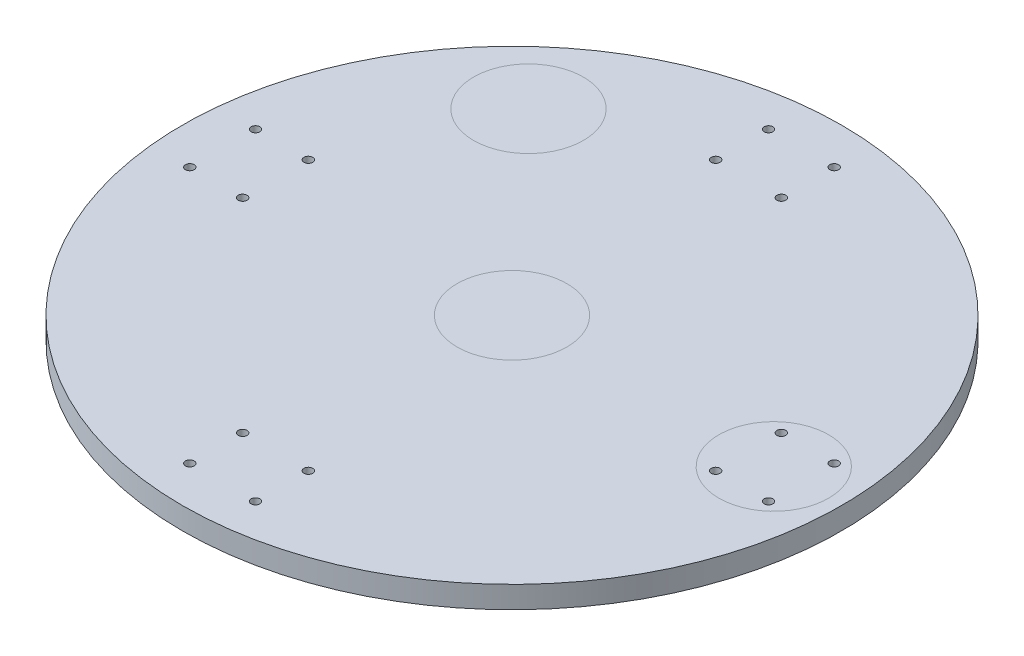
ISO-10303-21;
HEADER;
FILE_DESCRIPTION(('STEP AP214'),'2;1');
FILE_NAME('part.step','',(''),(''),'','','');
FILE_SCHEMA(('AUTOMOTIVE_DESIGN { 1 0 10303 214 1 1 1 1 }'));
ENDSEC;
DATA;
#1=APPLICATION_CONTEXT('core data for automotive mechanical design processes');
#2=APPLICATION_PROTOCOL_DEFINITION('international standard','automotive_design',2000,#1);
#3=PRODUCT_CONTEXT('',#1,'mechanical');
#4=PRODUCT('Part','Part','',(#3));
#5=PRODUCT_RELATED_PRODUCT_CATEGORY('part','',(#4));
#6=PRODUCT_DEFINITION_FORMATION('','',#4);
#7=PRODUCT_DEFINITION_CONTEXT('part definition',#1,'design');
#8=PRODUCT_DEFINITION('design','',#6,#7);
#9=PRODUCT_DEFINITION_SHAPE('','',#8);
#10=(LENGTH_UNIT() NAMED_UNIT(*) SI_UNIT(.MILLI.,.METRE.));
#11=(NAMED_UNIT(*) PLANE_ANGLE_UNIT() SI_UNIT($,.RADIAN.));
#12=(NAMED_UNIT(*) SI_UNIT($,.STERADIAN.) SOLID_ANGLE_UNIT());
#13=UNCERTAINTY_MEASURE_WITH_UNIT(LENGTH_MEASURE(1.E-05),#10,'distance_accuracy_value','');
#14=(GEOMETRIC_REPRESENTATION_CONTEXT(3) GLOBAL_UNCERTAINTY_ASSIGNED_CONTEXT((#13)) GLOBAL_UNIT_ASSIGNED_CONTEXT((#10,
#11,#12)) REPRESENTATION_CONTEXT('',''));
#15=CARTESIAN_POINT('',(0.,0.,0.));
#16=DIRECTION('',(0.,0.,1.));
#17=DIRECTION('',(1.,0.,0.));
#18=AXIS2_PLACEMENT_3D('',#15,#16,#17);
#19=CARTESIAN_POINT('',(0.,10.,0.));
#20=DIRECTION('',(0.,1.,0.));
#21=DIRECTION('',(0.,0.,1.));
#22=AXIS2_PLACEMENT_3D('',#19,#20,#21);
#23=PLANE('',#22);
#24=CARTESIAN_POINT('',(-77.6699029126213,10.,-85.1721094439541));
#25=DIRECTION('',(0.,1.,0.));
#26=DIRECTION('',(0.,0.,1.));
#27=AXIS2_PLACEMENT_3D('',#24,#25,#26);
#28=CIRCLE('',#27,25.);
#29=CARTESIAN_POINT('',(-77.6699029126213,10.,-60.1721094439541));
#30=VERTEX_POINT('',#29);
#31=EDGE_CURVE('E52',#30,#30,#28,.F.);
#32=ORIENTED_EDGE('',*,*,#31,.T.);
#33=EDGE_LOOP('',(#32));
#34=FACE_BOUND('',#33,.T.);
#35=CARTESIAN_POINT('',(0.,10.,0.));
#36=DIRECTION('',(0.,1.,0.));
#37=DIRECTION('',(0.,0.,1.));
#38=AXIS2_PLACEMENT_3D('',#35,#36,#37);
#39=CIRCLE('',#38,150.);
#40=CARTESIAN_POINT('',(0.,10.,150.));
#41=VERTEX_POINT('',#40);
#42=EDGE_CURVE('E64',#41,#41,#39,.T.);
#43=ORIENTED_EDGE('',*,*,#42,.T.);
#44=EDGE_LOOP('',(#43));
#45=FACE_BOUND('',#44,.T.);
#46=CARTESIAN_POINT('',(-14.945,10.,-131.706442493381));
#47=DIRECTION('',(0.,1.,0.));
#48=DIRECTION('',(0.,0.,1.));
#49=AXIS2_PLACEMENT_3D('',#46,#47,#48);
#50=CIRCLE('',#49,2.);
#51=CARTESIAN_POINT('',(-14.945,10.,-129.706442493381));
#52=VERTEX_POINT('',#51);
#53=EDGE_CURVE('E75',#52,#52,#50,.T.);
#54=ORIENTED_EDGE('',*,*,#53,.F.);
#55=EDGE_LOOP('',(#54));
#56=FACE_BOUND('',#55,.T.);
#57=CARTESIAN_POINT('',(-131.706442493367,10.,14.9450000000136));
#58=DIRECTION('',(0.,1.,0.));
#59=DIRECTION('',(0.,0.,1.));
#60=AXIS2_PLACEMENT_3D('',#57,#58,#59);
#61=CIRCLE('',#60,2.);
#62=CARTESIAN_POINT('',(-131.706442493367,10.,16.9450000000136));
#63=VERTEX_POINT('',#62);
#64=EDGE_CURVE('E167',#63,#63,#61,.T.);
#65=ORIENTED_EDGE('',*,*,#64,.F.);
#66=EDGE_LOOP('',(#65));
#67=FACE_BOUND('',#66,.T.);
#68=CARTESIAN_POINT('',(-14.9449999999731,10.,131.706442493381));
#69=DIRECTION('',(0.,1.,0.));
#70=DIRECTION('',(0.,0.,-1.));
#71=AXIS2_PLACEMENT_3D('',#68,#69,#70);
#72=CIRCLE('',#71,2.);
#73=CARTESIAN_POINT('',(-14.9449999999731,10.,129.706442493381));
#74=VERTEX_POINT('',#73);
#75=EDGE_CURVE('E152',#74,#74,#72,.T.);
#76=ORIENTED_EDGE('',*,*,#75,.F.);
#77=EDGE_LOOP('',(#76));
#78=FACE_BOUND('',#77,.T.);
#79=CARTESIAN_POINT('',(-14.9449999999731,10.,107.646442493381));
#80=DIRECTION('',(0.,1.,0.));
#81=DIRECTION('',(0.,0.,-1.));
#82=AXIS2_PLACEMENT_3D('',#79,#80,#81);
#83=CIRCLE('',#82,2.);
#84=CARTESIAN_POINT('',(-14.9449999999731,10.,105.646442493381));
#85=VERTEX_POINT('',#84);
#86=EDGE_CURVE('E151',#85,#85,#83,.T.);
#87=ORIENTED_EDGE('',*,*,#86,.F.);
#88=EDGE_LOOP('',(#87));
#89=FACE_BOUND('',#88,.T.);
#90=CARTESIAN_POINT('',(14.9450000000269,10.,107.646442493381));
#91=DIRECTION('',(0.,1.,0.));
#92=DIRECTION('',(0.,0.,1.));
#93=AXIS2_PLACEMENT_3D('',#90,#91,#92);
#94=CIRCLE('',#93,2.);
#95=CARTESIAN_POINT('',(14.9450000000269,10.,109.646442493381));
#96=VERTEX_POINT('',#95);
#97=EDGE_CURVE('E136',#96,#96,#94,.T.);
#98=ORIENTED_EDGE('',*,*,#97,.F.);
#99=EDGE_LOOP('',(#98));
#100=FACE_BOUND('',#99,.T.);
#101=CARTESIAN_POINT('',(-107.646442493367,10.,14.9450000000136));
#102=DIRECTION('',(0.,1.,0.));
#103=DIRECTION('',(0.,0.,1.));
#104=AXIS2_PLACEMENT_3D('',#101,#102,#103);
#105=CIRCLE('',#104,2.);
#106=CARTESIAN_POINT('',(-107.646442493367,10.,16.9450000000136));
#107=VERTEX_POINT('',#106);
#108=EDGE_CURVE('E168',#107,#107,#105,.T.);
#109=ORIENTED_EDGE('',*,*,#108,.F.);
#110=EDGE_LOOP('',(#109));
#111=FACE_BOUND('',#110,.T.);
#112=CARTESIAN_POINT('',(-107.646442493367,10.,-14.9449999999864));
#113=DIRECTION('',(0.,1.,0.));
#114=DIRECTION('',(0.,0.,-1.));
#115=AXIS2_PLACEMENT_3D('',#112,#113,#114);
#116=CIRCLE('',#115,2.);
#117=CARTESIAN_POINT('',(-107.646442493367,10.,-16.9449999999864));
#118=VERTEX_POINT('',#117);
#119=EDGE_CURVE('E191',#118,#118,#116,.T.);
#120=ORIENTED_EDGE('',*,*,#119,.F.);
#121=EDGE_LOOP('',(#120));
#122=FACE_BOUND('',#121,.T.);
#123=CARTESIAN_POINT('',(-131.706442493367,10.,-14.9449999999864));
#124=DIRECTION('',(0.,1.,0.));
#125=DIRECTION('',(0.,0.,-1.));
#126=AXIS2_PLACEMENT_3D('',#123,#124,#125);
#127=CIRCLE('',#126,2.);
#128=CARTESIAN_POINT('',(-131.706442493367,10.,-16.9449999999864));
#129=VERTEX_POINT('',#128);
#130=EDGE_CURVE('E183',#129,#129,#127,.T.);
#131=ORIENTED_EDGE('',*,*,#130,.F.);
#132=EDGE_LOOP('',(#131));
#133=FACE_BOUND('',#132,.T.);
#134=CARTESIAN_POINT('',(14.9449999999991,10.,-131.706442493381));
#135=DIRECTION('',(0.,1.,0.));
#136=DIRECTION('',(0.,0.,-1.));
#137=AXIS2_PLACEMENT_3D('',#134,#135,#136);
#138=CIRCLE('',#137,2.);
#139=CARTESIAN_POINT('',(14.9449999999991,10.,-133.706442493381));
#140=VERTEX_POINT('',#139);
#141=EDGE_CURVE('E88',#140,#140,#138,.T.);
#142=ORIENTED_EDGE('',*,*,#141,.F.);
#143=EDGE_LOOP('',(#142));
#144=FACE_BOUND('',#143,.T.);
#145=CARTESIAN_POINT('',(14.9449999999993,10.,-107.646442493381));
#146=DIRECTION('',(0.,1.,0.));
#147=DIRECTION('',(0.,0.,-1.));
#148=AXIS2_PLACEMENT_3D('',#145,#146,#147);
#149=CIRCLE('',#148,2.);
#150=CARTESIAN_POINT('',(14.9449999999993,10.,-109.646442493381));
#151=VERTEX_POINT('',#150);
#152=EDGE_CURVE('E87',#151,#151,#149,.T.);
#153=ORIENTED_EDGE('',*,*,#152,.F.);
#154=EDGE_LOOP('',(#153));
#155=FACE_BOUND('',#154,.T.);
#156=CARTESIAN_POINT('',(-14.945,10.,-107.646442493381));
#157=DIRECTION('',(0.,1.,0.));
#158=DIRECTION('',(0.,0.,1.));
#159=AXIS2_PLACEMENT_3D('',#156,#157,#158);
#160=CIRCLE('',#159,2.);
#161=CARTESIAN_POINT('',(-14.945,10.,-105.646442493381));
#162=VERTEX_POINT('',#161);
#163=EDGE_CURVE('E79',#162,#162,#160,.T.);
#164=ORIENTED_EDGE('',*,*,#163,.F.);
#165=EDGE_LOOP('',(#164));
#166=FACE_BOUND('',#165,.T.);
#167=CARTESIAN_POINT('',(14.9450000000269,10.,131.706442493381));
#168=DIRECTION('',(0.,1.,0.));
#169=DIRECTION('',(0.,0.,1.));
#170=AXIS2_PLACEMENT_3D('',#167,#168,#169);
#171=CIRCLE('',#170,2.);
#172=CARTESIAN_POINT('',(14.9450000000269,10.,133.706442493381));
#173=VERTEX_POINT('',#172);
#174=EDGE_CURVE('E135',#173,#173,#171,.T.);
#175=ORIENTED_EDGE('',*,*,#174,.F.);
#176=EDGE_LOOP('',(#175));
#177=FACE_BOUND('',#176,.T.);
#178=CARTESIAN_POINT('',(0.,10.,0.));
#179=DIRECTION('',(0.,1.,0.));
#180=DIRECTION('',(0.,0.,1.));
#181=AXIS2_PLACEMENT_3D('',#178,#179,#180);
#182=CIRCLE('',#181,25.);
#183=CARTESIAN_POINT('',(0.,10.,25.));
#184=VERTEX_POINT('',#183);
#185=EDGE_CURVE('E58',#184,#184,#182,.F.);
#186=ORIENTED_EDGE('',*,*,#185,.T.);
#187=EDGE_LOOP('',(#186));
#188=FACE_BOUND('',#187,.T.);
#189=CARTESIAN_POINT('',(119.152691968226,10.,0.));
#190=DIRECTION('',(0.,1.,0.));
#191=DIRECTION('',(0.,0.,1.));
#192=AXIS2_PLACEMENT_3D('',#189,#190,#191);
#193=CIRCLE('',#192,25.);
#194=CARTESIAN_POINT('',(119.152691968226,10.,25.));
#195=VERTEX_POINT('',#194);
#196=EDGE_CURVE('E10',#195,#195,#193,.F.);
#197=ORIENTED_EDGE('',*,*,#196,.T.);
#198=EDGE_LOOP('',(#197));
#199=FACE_BOUND('',#198,.T.);
#200=ADVANCED_FACE('F44',(#34,#45,#56,#67,#78,#89,#100,#111,#122,#133,#144,#155,#166,#177,#188,
#199),#23,.T.);
#201=ORIENTED_EDGE('',*,*,#196,.F.);
#202=EDGE_LOOP('',(#201));
#203=FACE_BOUND('',#202,.T.);
#204=CARTESIAN_POINT('',(107.646442493394,10.,-14.9450000000134));
#205=DIRECTION('',(0.,1.,0.));
#206=DIRECTION('',(0.,0.,1.));
#207=AXIS2_PLACEMENT_3D('',#204,#205,#206);
#208=CIRCLE('',#207,2.);
#209=CARTESIAN_POINT('',(107.646442493394,10.,-12.9450000000134));
#210=VERTEX_POINT('',#209);
#211=EDGE_CURVE('E104',#210,#210,#208,.T.);
#212=ORIENTED_EDGE('',*,*,#211,.F.);
#213=EDGE_LOOP('',(#212));
#214=FACE_BOUND('',#213,.T.);
#215=CARTESIAN_POINT('',(107.646442493394,10.,14.9449999999866));
#216=DIRECTION('',(0.,1.,0.));
#217=DIRECTION('',(0.,0.,-1.));
#218=AXIS2_PLACEMENT_3D('',#215,#216,#217);
#219=CIRCLE('',#218,2.);
#220=CARTESIAN_POINT('',(107.646442493394,10.,12.9449999999866));
#221=VERTEX_POINT('',#220);
#222=EDGE_CURVE('E119',#221,#221,#219,.T.);
#223=ORIENTED_EDGE('',*,*,#222,.F.);
#224=EDGE_LOOP('',(#223));
#225=FACE_BOUND('',#224,.T.);
#226=CARTESIAN_POINT('',(131.706442493394,10.,14.9449999999866));
#227=DIRECTION('',(0.,1.,0.));
#228=DIRECTION('',(0.,0.,-1.));
#229=AXIS2_PLACEMENT_3D('',#226,#227,#228);
#230=CIRCLE('',#229,2.);
#231=CARTESIAN_POINT('',(131.706442493394,10.,12.9449999999866));
#232=VERTEX_POINT('',#231);
#233=EDGE_CURVE('E120',#232,#232,#230,.T.);
#234=ORIENTED_EDGE('',*,*,#233,.F.);
#235=EDGE_LOOP('',(#234));
#236=FACE_BOUND('',#235,.T.);
#237=CARTESIAN_POINT('',(131.706442493394,10.,-14.9450000000134));
#238=DIRECTION('',(0.,1.,0.));
#239=DIRECTION('',(0.,0.,1.));
#240=AXIS2_PLACEMENT_3D('',#237,#238,#239);
#241=CIRCLE('',#240,2.);
#242=CARTESIAN_POINT('',(131.706442493394,10.,-12.9450000000134));
#243=VERTEX_POINT('',#242);
#244=EDGE_CURVE('E103',#243,#243,#241,.T.);
#245=ORIENTED_EDGE('',*,*,#244,.F.);
#246=EDGE_LOOP('',(#245));
#247=FACE_BOUND('',#246,.T.);
#248=ADVANCED_FACE('F207',(#203,#214,#225,#236,#247),#23,.T.);
#249=ORIENTED_EDGE('',*,*,#31,.F.);
#250=EDGE_LOOP('',(#249));
#251=FACE_BOUND('',#250,.T.);
#252=ADVANCED_FACE('F226',(#251),#23,.T.);
#253=CARTESIAN_POINT('',(0.,10.,0.));
#254=DIRECTION('',(0.,-1.,0.));
#255=DIRECTION('',(0.,0.,-1.));
#256=AXIS2_PLACEMENT_3D('',#253,#254,#255);
#257=CYLINDRICAL_SURFACE('',#256,150.);
#258=ORIENTED_EDGE('',*,*,#42,.F.);
#259=EDGE_LOOP('',(#258));
#260=FACE_BOUND('',#259,.T.);
#261=CARTESIAN_POINT('',(0.,0.,0.));
#262=DIRECTION('',(0.,1.,0.));
#263=DIRECTION('',(0.,0.,1.));
#264=AXIS2_PLACEMENT_3D('',#261,#262,#263);
#265=CIRCLE('',#264,150.);
#266=CARTESIAN_POINT('',(0.,0.,150.));
#267=VERTEX_POINT('',#266);
#268=EDGE_CURVE('E67',#267,#267,#265,.T.);
#269=ORIENTED_EDGE('',*,*,#268,.T.);
#270=EDGE_LOOP('',(#269));
#271=FACE_BOUND('',#270,.T.);
#272=ADVANCED_FACE('F46',(#260,#271),#257,.T.);
#273=ORIENTED_EDGE('',*,*,#185,.F.);
#274=EDGE_LOOP('',(#273));
#275=FACE_BOUND('',#274,.T.);
#276=ADVANCED_FACE('F209',(#275),#23,.T.);
#277=CARTESIAN_POINT('',(0.,0.,0.));
#278=DIRECTION('',(0.,1.,0.));
#279=DIRECTION('',(0.,0.,1.));
#280=AXIS2_PLACEMENT_3D('',#277,#278,#279);
#281=PLANE('',#280);
#282=CARTESIAN_POINT('',(107.646442493394,0.,-14.9450000000134));
#283=DIRECTION('',(0.,1.,0.));
#284=DIRECTION('',(0.,0.,1.));
#285=AXIS2_PLACEMENT_3D('',#282,#283,#284);
#286=CIRCLE('',#285,2.);
#287=CARTESIAN_POINT('',(107.646442493394,0.,-12.9450000000134));
#288=VERTEX_POINT('',#287);
#289=EDGE_CURVE('E124',#288,#288,#286,.T.);
#290=ORIENTED_EDGE('',*,*,#289,.T.);
#291=EDGE_LOOP('',(#290));
#292=FACE_BOUND('',#291,.T.);
#293=CARTESIAN_POINT('',(107.646442493394,0.,14.9449999999866));
#294=DIRECTION('',(0.,1.,0.));
#295=DIRECTION('',(0.,0.,-1.));
#296=AXIS2_PLACEMENT_3D('',#293,#294,#295);
#297=CIRCLE('',#296,2.);
#298=CARTESIAN_POINT('',(107.646442493394,0.,12.9449999999866));
#299=VERTEX_POINT('',#298);
#300=EDGE_CURVE('E115',#299,#299,#297,.T.);
#301=ORIENTED_EDGE('',*,*,#300,.T.);
#302=EDGE_LOOP('',(#301));
#303=FACE_BOUND('',#302,.T.);
#304=CARTESIAN_POINT('',(131.706442493394,0.,14.9449999999866));
#305=DIRECTION('',(0.,1.,0.));
#306=DIRECTION('',(0.,0.,-1.));
#307=AXIS2_PLACEMENT_3D('',#304,#305,#306);
#308=CIRCLE('',#307,2.);
#309=CARTESIAN_POINT('',(131.706442493394,0.,12.9449999999866));
#310=VERTEX_POINT('',#309);
#311=EDGE_CURVE('E140',#310,#310,#308,.T.);
#312=ORIENTED_EDGE('',*,*,#311,.T.);
#313=EDGE_LOOP('',(#312));
#314=FACE_BOUND('',#313,.T.);
#315=CARTESIAN_POINT('',(14.9450000000269,0.,131.706442493381));
#316=DIRECTION('',(0.,1.,0.));
#317=DIRECTION('',(0.,0.,1.));
#318=AXIS2_PLACEMENT_3D('',#315,#316,#317);
#319=CIRCLE('',#318,2.);
#320=CARTESIAN_POINT('',(14.9450000000269,0.,133.706442493381));
#321=VERTEX_POINT('',#320);
#322=EDGE_CURVE('E131',#321,#321,#319,.T.);
#323=ORIENTED_EDGE('',*,*,#322,.T.);
#324=EDGE_LOOP('',(#323));
#325=FACE_BOUND('',#324,.T.);
#326=CARTESIAN_POINT('',(-14.945,0.,-107.646442493381));
#327=DIRECTION('',(0.,1.,0.));
#328=DIRECTION('',(0.,0.,1.));
#329=AXIS2_PLACEMENT_3D('',#326,#327,#328);
#330=CIRCLE('',#329,2.);
#331=CARTESIAN_POINT('',(-14.945,0.,-105.646442493381));
#332=VERTEX_POINT('',#331);
#333=EDGE_CURVE('E92',#332,#332,#330,.T.);
#334=ORIENTED_EDGE('',*,*,#333,.T.);
#335=EDGE_LOOP('',(#334));
#336=FACE_BOUND('',#335,.T.);
#337=CARTESIAN_POINT('',(14.9449999999993,0.,-107.646442493381));
#338=DIRECTION('',(0.,1.,0.));
#339=DIRECTION('',(0.,0.,-1.));
#340=AXIS2_PLACEMENT_3D('',#337,#338,#339);
#341=CIRCLE('',#340,2.);
#342=CARTESIAN_POINT('',(14.9449999999993,0.,-109.646442493381));
#343=VERTEX_POINT('',#342);
#344=EDGE_CURVE('E83',#343,#343,#341,.T.);
#345=ORIENTED_EDGE('',*,*,#344,.T.);
#346=EDGE_LOOP('',(#345));
#347=FACE_BOUND('',#346,.T.);
#348=CARTESIAN_POINT('',(14.9449999999991,0.,-131.706442493381));
#349=DIRECTION('',(0.,1.,0.));
#350=DIRECTION('',(0.,0.,-1.));
#351=AXIS2_PLACEMENT_3D('',#348,#349,#350);
#352=CIRCLE('',#351,2.);
#353=CARTESIAN_POINT('',(14.9449999999991,0.,-133.706442493381));
#354=VERTEX_POINT('',#353);
#355=EDGE_CURVE('E108',#354,#354,#352,.T.);
#356=ORIENTED_EDGE('',*,*,#355,.T.);
#357=EDGE_LOOP('',(#356));
#358=FACE_BOUND('',#357,.T.);
#359=CARTESIAN_POINT('',(131.706442493394,0.,-14.9450000000134));
#360=DIRECTION('',(0.,1.,0.));
#361=DIRECTION('',(0.,0.,1.));
#362=AXIS2_PLACEMENT_3D('',#359,#360,#361);
#363=CIRCLE('',#362,2.);
#364=CARTESIAN_POINT('',(131.706442493394,0.,-12.9450000000134));
#365=VERTEX_POINT('',#364);
#366=EDGE_CURVE('E99',#365,#365,#363,.T.);
#367=ORIENTED_EDGE('',*,*,#366,.T.);
#368=EDGE_LOOP('',(#367));
#369=FACE_BOUND('',#368,.T.);
#370=CARTESIAN_POINT('',(-131.706442493367,0.,-14.9449999999864));
#371=DIRECTION('',(0.,1.,0.));
#372=DIRECTION('',(0.,0.,-1.));
#373=AXIS2_PLACEMENT_3D('',#370,#371,#372);
#374=CIRCLE('',#373,2.);
#375=CARTESIAN_POINT('',(-131.706442493367,0.,-16.9449999999864));
#376=VERTEX_POINT('',#375);
#377=EDGE_CURVE('E179',#376,#376,#374,.T.);
#378=ORIENTED_EDGE('',*,*,#377,.T.);
#379=EDGE_LOOP('',(#378));
#380=FACE_BOUND('',#379,.T.);
#381=CARTESIAN_POINT('',(-107.646442493367,0.,-14.9449999999864));
#382=DIRECTION('',(0.,1.,0.));
#383=DIRECTION('',(0.,0.,-1.));
#384=AXIS2_PLACEMENT_3D('',#381,#382,#383);
#385=CIRCLE('',#384,2.);
#386=CARTESIAN_POINT('',(-107.646442493367,0.,-16.9449999999864));
#387=VERTEX_POINT('',#386);
#388=EDGE_CURVE('E187',#387,#387,#385,.T.);
#389=ORIENTED_EDGE('',*,*,#388,.T.);
#390=EDGE_LOOP('',(#389));
#391=FACE_BOUND('',#390,.T.);
#392=CARTESIAN_POINT('',(-107.646442493367,0.,14.9450000000136));
#393=DIRECTION('',(0.,1.,0.));
#394=DIRECTION('',(0.,0.,1.));
#395=AXIS2_PLACEMENT_3D('',#392,#393,#394);
#396=CIRCLE('',#395,2.);
#397=CARTESIAN_POINT('',(-107.646442493367,0.,16.9450000000136));
#398=VERTEX_POINT('',#397);
#399=EDGE_CURVE('E195',#398,#398,#396,.T.);
#400=ORIENTED_EDGE('',*,*,#399,.T.);
#401=EDGE_LOOP('',(#400));
#402=FACE_BOUND('',#401,.T.);
#403=CARTESIAN_POINT('',(14.9450000000269,0.,107.646442493381));
#404=DIRECTION('',(0.,1.,0.));
#405=DIRECTION('',(0.,0.,1.));
#406=AXIS2_PLACEMENT_3D('',#403,#404,#405);
#407=CIRCLE('',#406,2.);
#408=CARTESIAN_POINT('',(14.9450000000269,0.,109.646442493381));
#409=VERTEX_POINT('',#408);
#410=EDGE_CURVE('E156',#409,#409,#407,.T.);
#411=ORIENTED_EDGE('',*,*,#410,.T.);
#412=EDGE_LOOP('',(#411));
#413=FACE_BOUND('',#412,.T.);
#414=CARTESIAN_POINT('',(-14.9449999999731,0.,107.646442493381));
#415=DIRECTION('',(0.,1.,0.));
#416=DIRECTION('',(0.,0.,-1.));
#417=AXIS2_PLACEMENT_3D('',#414,#415,#416);
#418=CIRCLE('',#417,2.);
#419=CARTESIAN_POINT('',(-14.9449999999731,0.,105.646442493381));
#420=VERTEX_POINT('',#419);
#421=EDGE_CURVE('E147',#420,#420,#418,.T.);
#422=ORIENTED_EDGE('',*,*,#421,.T.);
#423=EDGE_LOOP('',(#422));
#424=FACE_BOUND('',#423,.T.);
#425=CARTESIAN_POINT('',(-14.9449999999731,0.,131.706442493381));
#426=DIRECTION('',(0.,1.,0.));
#427=DIRECTION('',(0.,0.,-1.));
#428=AXIS2_PLACEMENT_3D('',#425,#426,#427);
#429=CIRCLE('',#428,2.);
#430=CARTESIAN_POINT('',(-14.9449999999731,0.,129.706442493381));
#431=VERTEX_POINT('',#430);
#432=EDGE_CURVE('E172',#431,#431,#429,.T.);
#433=ORIENTED_EDGE('',*,*,#432,.T.);
#434=EDGE_LOOP('',(#433));
#435=FACE_BOUND('',#434,.T.);
#436=CARTESIAN_POINT('',(-131.706442493367,0.,14.9450000000136));
#437=DIRECTION('',(0.,1.,0.));
#438=DIRECTION('',(0.,0.,1.));
#439=AXIS2_PLACEMENT_3D('',#436,#437,#438);
#440=CIRCLE('',#439,2.);
#441=CARTESIAN_POINT('',(-131.706442493367,0.,16.9450000000136));
#442=VERTEX_POINT('',#441);
#443=EDGE_CURVE('E163',#442,#442,#440,.T.);
#444=ORIENTED_EDGE('',*,*,#443,.T.);
#445=EDGE_LOOP('',(#444));
#446=FACE_BOUND('',#445,.T.);
#447=CARTESIAN_POINT('',(-14.945,0.,-131.706442493381));
#448=DIRECTION('',(0.,1.,0.));
#449=DIRECTION('',(0.,0.,1.));
#450=AXIS2_PLACEMENT_3D('',#447,#448,#449);
#451=CIRCLE('',#450,2.);
#452=CARTESIAN_POINT('',(-14.945,0.,-129.706442493381));
#453=VERTEX_POINT('',#452);
#454=EDGE_CURVE('E71',#453,#453,#451,.T.);
#455=ORIENTED_EDGE('',*,*,#454,.T.);
#456=EDGE_LOOP('',(#455));
#457=FACE_BOUND('',#456,.T.);
#458=ORIENTED_EDGE('',*,*,#268,.F.);
#459=EDGE_LOOP('',(#458));
#460=FACE_BOUND('',#459,.T.);
#461=ADVANCED_FACE('F225',(#292,#303,#314,#325,#336,#347,#358,#369,#380,#391,#402,#413,#424,
#435,#446,#457,#460),#281,.F.);
#462=CARTESIAN_POINT('',(-14.945,0.,-131.706442493381));
#463=DIRECTION('',(0.,1.,0.));
#464=DIRECTION('',(0.,0.,1.));
#465=AXIS2_PLACEMENT_3D('',#462,#463,#464);
#466=CYLINDRICAL_SURFACE('',#465,2.);
#467=ORIENTED_EDGE('',*,*,#454,.F.);
#468=EDGE_LOOP('',(#467));
#469=FACE_BOUND('',#468,.T.);
#470=ORIENTED_EDGE('',*,*,#53,.T.);
#471=EDGE_LOOP('',(#470));
#472=FACE_BOUND('',#471,.T.);
#473=ADVANCED_FACE('F231',(#469,#472),#466,.F.);
#474=CARTESIAN_POINT('',(-131.706442493367,0.,14.9450000000136));
#475=DIRECTION('',(0.,1.,0.));
#476=DIRECTION('',(0.,0.,1.));
#477=AXIS2_PLACEMENT_3D('',#474,#475,#476);
#478=CYLINDRICAL_SURFACE('',#477,2.);
#479=ORIENTED_EDGE('',*,*,#443,.F.);
#480=EDGE_LOOP('',(#479));
#481=FACE_BOUND('',#480,.T.);
#482=ORIENTED_EDGE('',*,*,#64,.T.);
#483=EDGE_LOOP('',(#482));
#484=FACE_BOUND('',#483,.T.);
#485=ADVANCED_FACE('F279',(#481,#484),#478,.F.);
#486=CARTESIAN_POINT('',(-14.9449999999731,0.,131.706442493381));
#487=DIRECTION('',(0.,1.,0.));
#488=DIRECTION('',(0.,0.,1.));
#489=AXIS2_PLACEMENT_3D('',#486,#487,#488);
#490=CYLINDRICAL_SURFACE('',#489,2.);
#491=ORIENTED_EDGE('',*,*,#432,.F.);
#492=EDGE_LOOP('',(#491));
#493=FACE_BOUND('',#492,.T.);
#494=ORIENTED_EDGE('',*,*,#75,.T.);
#495=EDGE_LOOP('',(#494));
#496=FACE_BOUND('',#495,.T.);
#497=ADVANCED_FACE('F284',(#493,#496),#490,.F.);
#498=CARTESIAN_POINT('',(-14.9449999999731,0.,107.646442493381));
#499=DIRECTION('',(0.,1.,0.));
#500=DIRECTION('',(0.,0.,1.));
#501=AXIS2_PLACEMENT_3D('',#498,#499,#500);
#502=CYLINDRICAL_SURFACE('',#501,2.);
#503=ORIENTED_EDGE('',*,*,#421,.F.);
#504=EDGE_LOOP('',(#503));
#505=FACE_BOUND('',#504,.T.);
#506=ORIENTED_EDGE('',*,*,#86,.T.);
#507=EDGE_LOOP('',(#506));
#508=FACE_BOUND('',#507,.T.);
#509=ADVANCED_FACE('F302',(#505,#508),#502,.F.);
#510=CARTESIAN_POINT('',(14.9450000000269,0.,107.646442493381));
#511=DIRECTION('',(0.,1.,0.));
#512=DIRECTION('',(0.,0.,1.));
#513=AXIS2_PLACEMENT_3D('',#510,#511,#512);
#514=CYLINDRICAL_SURFACE('',#513,2.);
#515=ORIENTED_EDGE('',*,*,#410,.F.);
#516=EDGE_LOOP('',(#515));
#517=FACE_BOUND('',#516,.T.);
#518=ORIENTED_EDGE('',*,*,#97,.T.);
#519=EDGE_LOOP('',(#518));
#520=FACE_BOUND('',#519,.T.);
#521=ADVANCED_FACE('F300',(#517,#520),#514,.F.);
#522=CARTESIAN_POINT('',(-107.646442493367,0.,14.9450000000136));
#523=DIRECTION('',(0.,1.,0.));
#524=DIRECTION('',(0.,0.,1.));
#525=AXIS2_PLACEMENT_3D('',#522,#523,#524);
#526=CYLINDRICAL_SURFACE('',#525,2.);
#527=ORIENTED_EDGE('',*,*,#399,.F.);
#528=EDGE_LOOP('',(#527));
#529=FACE_BOUND('',#528,.T.);
#530=ORIENTED_EDGE('',*,*,#108,.T.);
#531=EDGE_LOOP('',(#530));
#532=FACE_BOUND('',#531,.T.);
#533=ADVANCED_FACE('F203',(#529,#532),#526,.F.);
#534=CARTESIAN_POINT('',(-107.646442493367,0.,-14.9449999999864));
#535=DIRECTION('',(0.,1.,0.));
#536=DIRECTION('',(0.,0.,1.));
#537=AXIS2_PLACEMENT_3D('',#534,#535,#536);
#538=CYLINDRICAL_SURFACE('',#537,2.);
#539=ORIENTED_EDGE('',*,*,#388,.F.);
#540=EDGE_LOOP('',(#539));
#541=FACE_BOUND('',#540,.T.);
#542=ORIENTED_EDGE('',*,*,#119,.T.);
#543=EDGE_LOOP('',(#542));
#544=FACE_BOUND('',#543,.T.);
#545=ADVANCED_FACE('F265',(#541,#544),#538,.F.);
#546=CARTESIAN_POINT('',(-131.706442493367,0.,-14.9449999999864));
#547=DIRECTION('',(0.,1.,0.));
#548=DIRECTION('',(0.,0.,1.));
#549=AXIS2_PLACEMENT_3D('',#546,#547,#548);
#550=CYLINDRICAL_SURFACE('',#549,2.);
#551=ORIENTED_EDGE('',*,*,#377,.F.);
#552=EDGE_LOOP('',(#551));
#553=FACE_BOUND('',#552,.T.);
#554=ORIENTED_EDGE('',*,*,#130,.T.);
#555=EDGE_LOOP('',(#554));
#556=FACE_BOUND('',#555,.T.);
#557=ADVANCED_FACE('F255',(#553,#556),#550,.F.);
#558=CARTESIAN_POINT('',(131.706442493394,0.,-14.9450000000134));
#559=DIRECTION('',(0.,1.,0.));
#560=DIRECTION('',(0.,0.,1.));
#561=AXIS2_PLACEMENT_3D('',#558,#559,#560);
#562=CYLINDRICAL_SURFACE('',#561,2.);
#563=ORIENTED_EDGE('',*,*,#366,.F.);
#564=EDGE_LOOP('',(#563));
#565=FACE_BOUND('',#564,.T.);
#566=ORIENTED_EDGE('',*,*,#244,.T.);
#567=EDGE_LOOP('',(#566));
#568=FACE_BOUND('',#567,.T.);
#569=ADVANCED_FACE('F252',(#565,#568),#562,.F.);
#570=CARTESIAN_POINT('',(14.9449999999991,0.,-131.706442493381));
#571=DIRECTION('',(0.,1.,0.));
#572=DIRECTION('',(0.,0.,1.));
#573=AXIS2_PLACEMENT_3D('',#570,#571,#572);
#574=CYLINDRICAL_SURFACE('',#573,2.);
#575=ORIENTED_EDGE('',*,*,#355,.F.);
#576=EDGE_LOOP('',(#575));
#577=FACE_BOUND('',#576,.T.);
#578=ORIENTED_EDGE('',*,*,#141,.T.);
#579=EDGE_LOOP('',(#578));
#580=FACE_BOUND('',#579,.T.);
#581=ADVANCED_FACE('F254',(#577,#580),#574,.F.);
#582=CARTESIAN_POINT('',(14.9449999999993,0.,-107.646442493381));
#583=DIRECTION('',(0.,1.,0.));
#584=DIRECTION('',(0.,0.,1.));
#585=AXIS2_PLACEMENT_3D('',#582,#583,#584);
#586=CYLINDRICAL_SURFACE('',#585,2.);
#587=ORIENTED_EDGE('',*,*,#344,.F.);
#588=EDGE_LOOP('',(#587));
#589=FACE_BOUND('',#588,.T.);
#590=ORIENTED_EDGE('',*,*,#152,.T.);
#591=EDGE_LOOP('',(#590));
#592=FACE_BOUND('',#591,.T.);
#593=ADVANCED_FACE('F262',(#589,#592),#586,.F.);
#594=CARTESIAN_POINT('',(-14.945,0.,-107.646442493381));
#595=DIRECTION('',(0.,1.,0.));
#596=DIRECTION('',(0.,0.,1.));
#597=AXIS2_PLACEMENT_3D('',#594,#595,#596);
#598=CYLINDRICAL_SURFACE('',#597,2.);
#599=ORIENTED_EDGE('',*,*,#333,.F.);
#600=EDGE_LOOP('',(#599));
#601=FACE_BOUND('',#600,.T.);
#602=ORIENTED_EDGE('',*,*,#163,.T.);
#603=EDGE_LOOP('',(#602));
#604=FACE_BOUND('',#603,.T.);
#605=ADVANCED_FACE('F271',(#601,#604),#598,.F.);
#606=CARTESIAN_POINT('',(14.9450000000269,0.,131.706442493381));
#607=DIRECTION('',(0.,1.,0.));
#608=DIRECTION('',(0.,0.,1.));
#609=AXIS2_PLACEMENT_3D('',#606,#607,#608);
#610=CYLINDRICAL_SURFACE('',#609,2.);
#611=ORIENTED_EDGE('',*,*,#322,.F.);
#612=EDGE_LOOP('',(#611));
#613=FACE_BOUND('',#612,.T.);
#614=ORIENTED_EDGE('',*,*,#174,.T.);
#615=EDGE_LOOP('',(#614));
#616=FACE_BOUND('',#615,.T.);
#617=ADVANCED_FACE('F274',(#613,#616),#610,.F.);
#618=CARTESIAN_POINT('',(131.706442493394,0.,14.9449999999866));
#619=DIRECTION('',(0.,1.,0.));
#620=DIRECTION('',(0.,0.,1.));
#621=AXIS2_PLACEMENT_3D('',#618,#619,#620);
#622=CYLINDRICAL_SURFACE('',#621,2.);
#623=ORIENTED_EDGE('',*,*,#311,.F.);
#624=EDGE_LOOP('',(#623));
#625=FACE_BOUND('',#624,.T.);
#626=ORIENTED_EDGE('',*,*,#233,.T.);
#627=EDGE_LOOP('',(#626));
#628=FACE_BOUND('',#627,.T.);
#629=ADVANCED_FACE('F316',(#625,#628),#622,.F.);
#630=CARTESIAN_POINT('',(107.646442493394,0.,14.9449999999866));
#631=DIRECTION('',(0.,1.,0.));
#632=DIRECTION('',(0.,0.,1.));
#633=AXIS2_PLACEMENT_3D('',#630,#631,#632);
#634=CYLINDRICAL_SURFACE('',#633,2.);
#635=ORIENTED_EDGE('',*,*,#300,.F.);
#636=EDGE_LOOP('',(#635));
#637=FACE_BOUND('',#636,.T.);
#638=ORIENTED_EDGE('',*,*,#222,.T.);
#639=EDGE_LOOP('',(#638));
#640=FACE_BOUND('',#639,.T.);
#641=ADVANCED_FACE('F319',(#637,#640),#634,.F.);
#642=CARTESIAN_POINT('',(107.646442493394,0.,-14.9450000000134));
#643=DIRECTION('',(0.,1.,0.));
#644=DIRECTION('',(0.,0.,1.));
#645=AXIS2_PLACEMENT_3D('',#642,#643,#644);
#646=CYLINDRICAL_SURFACE('',#645,2.);
#647=ORIENTED_EDGE('',*,*,#289,.F.);
#648=EDGE_LOOP('',(#647));
#649=FACE_BOUND('',#648,.T.);
#650=ORIENTED_EDGE('',*,*,#211,.T.);
#651=EDGE_LOOP('',(#650));
#652=FACE_BOUND('',#651,.T.);
#653=ADVANCED_FACE('F324',(#649,#652),#646,.F.);
#654=CLOSED_SHELL('',(#200,#248,#252,#272,#276,#461,#473,#485,#497,#509,#521,#533,#545,#557,
#569,#581,#593,#605,#617,#629,#641,#653));
#655=MANIFOLD_SOLID_BREP('B2',#654);
#656=ADVANCED_BREP_SHAPE_REPRESENTATION('',(#18,#655),#14);
#657=SHAPE_DEFINITION_REPRESENTATION(#9,#656);
ENDSEC;
END-ISO-10303-21;
